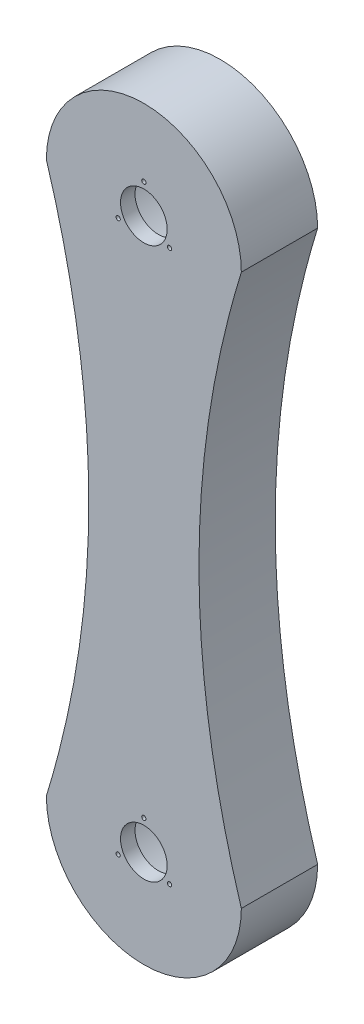
ISO-10303-21;
HEADER;
FILE_DESCRIPTION(('STEP AP214'),'2;1');
FILE_NAME('part.step','',(''),(''),'','','');
FILE_SCHEMA(('AUTOMOTIVE_DESIGN { 1 0 10303 214 1 1 1 1 }'));
ENDSEC;
DATA;
#1=APPLICATION_CONTEXT('core data for automotive mechanical design processes');
#2=APPLICATION_PROTOCOL_DEFINITION('international standard','automotive_design',2000,#1);
#3=PRODUCT_CONTEXT('',#1,'mechanical');
#4=PRODUCT('Part','Part','',(#3));
#5=PRODUCT_RELATED_PRODUCT_CATEGORY('part','',(#4));
#6=PRODUCT_DEFINITION_FORMATION('','',#4);
#7=PRODUCT_DEFINITION_CONTEXT('part definition',#1,'design');
#8=PRODUCT_DEFINITION('design','',#6,#7);
#9=PRODUCT_DEFINITION_SHAPE('','',#8);
#10=(LENGTH_UNIT() NAMED_UNIT(*) SI_UNIT(.MILLI.,.METRE.));
#11=(NAMED_UNIT(*) PLANE_ANGLE_UNIT() SI_UNIT($,.RADIAN.));
#12=(NAMED_UNIT(*) SI_UNIT($,.STERADIAN.) SOLID_ANGLE_UNIT());
#13=UNCERTAINTY_MEASURE_WITH_UNIT(LENGTH_MEASURE(1.E-05),#10,'distance_accuracy_value','');
#14=(GEOMETRIC_REPRESENTATION_CONTEXT(3) GLOBAL_UNCERTAINTY_ASSIGNED_CONTEXT((#13)) GLOBAL_UNIT_ASSIGNED_CONTEXT((#10,
#11,#12)) REPRESENTATION_CONTEXT('',''));
#15=CARTESIAN_POINT('',(0.,0.,0.));
#16=DIRECTION('',(0.,0.,1.));
#17=DIRECTION('',(1.,0.,0.));
#18=AXIS2_PLACEMENT_3D('',#15,#16,#17);
#19=CARTESIAN_POINT('',(-115.,650.,90.));
#20=CARTESIAN_POINT('',(-15.,325.,90.));
#21=CARTESIAN_POINT('',(-115.,0.,90.));
#22=B_SPLINE_CURVE_WITH_KNOTS('',2,(#19,#20,#21),.UNSPECIFIED.,.F.,.F.,(3,3),(0.,1.),.UNSPECIFIED.);
#23=DIRECTION('',(0.,0.,-1.));
#24=VECTOR('',#23,1.);
#25=SURFACE_OF_LINEAR_EXTRUSION('',#22,#24);
#26=CARTESIAN_POINT('',(-115.,650.,0.));
#27=CARTESIAN_POINT('',(-15.,325.,0.));
#28=CARTESIAN_POINT('',(-115.,0.,0.));
#29=B_SPLINE_CURVE_WITH_KNOTS('',2,(#26,#27,#28),.UNSPECIFIED.,.F.,.F.,(3,3),(0.,1.),.UNSPECIFIED.);
#30=CARTESIAN_POINT('',(-115.,650.,0.));
#31=VERTEX_POINT('',#30);
#32=CARTESIAN_POINT('',(-115.,0.,0.));
#33=VERTEX_POINT('',#32);
#34=EDGE_CURVE('E125',#31,#33,#29,.T.);
#35=ORIENTED_EDGE('',*,*,#34,.T.);
#36=DIRECTION('',(0.,0.,-1.));
#37=VECTOR('',#36,1.);
#38=CARTESIAN_POINT('',(-115.,0.,90.));
#39=LINE('',#38,#37);
#40=CARTESIAN_POINT('',(-115.,0.,90.));
#41=VERTEX_POINT('',#40);
#42=EDGE_CURVE('E11',#41,#33,#39,.T.);
#43=ORIENTED_EDGE('',*,*,#42,.F.);
#44=CARTESIAN_POINT('',(-115.,650.,90.));
#45=VERTEX_POINT('',#44);
#46=EDGE_CURVE('E93',#45,#41,#22,.T.);
#47=ORIENTED_EDGE('',*,*,#46,.F.);
#48=DIRECTION('',(0.,0.,-1.));
#49=VECTOR('',#48,1.);
#50=CARTESIAN_POINT('',(-115.,650.,90.));
#51=LINE('',#50,#49);
#52=EDGE_CURVE('E102',#45,#31,#51,.T.);
#53=ORIENTED_EDGE('',*,*,#52,.T.);
#54=EDGE_LOOP('',(#35,#43,#47,#53));
#55=FACE_BOUND('',#54,.T.);
#56=ADVANCED_FACE('F39',(#55),#25,.F.);
#57=CARTESIAN_POINT('',(0.,0.,90.));
#58=DIRECTION('',(0.,0.,-1.));
#59=DIRECTION('',(-1.,0.,0.));
#60=AXIS2_PLACEMENT_3D('',#57,#58,#59);
#61=CYLINDRICAL_SURFACE('',#60,115.);
#62=CARTESIAN_POINT('',(0.,0.,0.));
#63=DIRECTION('',(0.,0.,1.));
#64=DIRECTION('',(1.,0.,0.));
#65=AXIS2_PLACEMENT_3D('',#62,#63,#64);
#66=CIRCLE('',#65,115.);
#67=CARTESIAN_POINT('',(115.,0.,0.));
#68=VERTEX_POINT('',#67);
#69=EDGE_CURVE('E97',#33,#68,#66,.T.);
#70=ORIENTED_EDGE('',*,*,#69,.T.);
#71=DIRECTION('',(0.,0.,-1.));
#72=VECTOR('',#71,1.);
#73=CARTESIAN_POINT('',(115.,0.,90.));
#74=LINE('',#73,#72);
#75=CARTESIAN_POINT('',(115.,0.,90.));
#76=VERTEX_POINT('',#75);
#77=EDGE_CURVE('E49',#76,#68,#74,.T.);
#78=ORIENTED_EDGE('',*,*,#77,.F.);
#79=CARTESIAN_POINT('',(0.,0.,90.));
#80=DIRECTION('',(0.,0.,1.));
#81=DIRECTION('',(1.,0.,0.));
#82=AXIS2_PLACEMENT_3D('',#79,#80,#81);
#83=CIRCLE('',#82,115.);
#84=EDGE_CURVE('E88',#41,#76,#83,.T.);
#85=ORIENTED_EDGE('',*,*,#84,.F.);
#86=ORIENTED_EDGE('',*,*,#42,.T.);
#87=EDGE_LOOP('',(#70,#78,#85,#86));
#88=FACE_BOUND('',#87,.T.);
#89=ADVANCED_FACE('F96',(#88),#61,.T.);
#90=CARTESIAN_POINT('',(115.,0.,90.));
#91=CARTESIAN_POINT('',(15.,325.,90.));
#92=CARTESIAN_POINT('',(115.,650.,90.));
#93=B_SPLINE_CURVE_WITH_KNOTS('',2,(#90,#91,#92),.UNSPECIFIED.,.F.,.F.,(3,3),(0.,1.),.UNSPECIFIED.);
#94=DIRECTION('',(0.,0.,-1.));
#95=VECTOR('',#94,1.);
#96=SURFACE_OF_LINEAR_EXTRUSION('',#93,#95);
#97=CARTESIAN_POINT('',(115.,0.,0.));
#98=CARTESIAN_POINT('',(15.,325.,0.));
#99=CARTESIAN_POINT('',(115.,650.,0.));
#100=B_SPLINE_CURVE_WITH_KNOTS('',2,(#97,#98,#99),.UNSPECIFIED.,.F.,.F.,(3,3),(0.,1.),.UNSPECIFIED.);
#101=CARTESIAN_POINT('',(115.,650.,0.));
#102=VERTEX_POINT('',#101);
#103=EDGE_CURVE('E75',#68,#102,#100,.T.);
#104=ORIENTED_EDGE('',*,*,#103,.T.);
#105=DIRECTION('',(0.,0.,-1.));
#106=VECTOR('',#105,1.);
#107=CARTESIAN_POINT('',(115.,650.,90.));
#108=LINE('',#107,#106);
#109=CARTESIAN_POINT('',(115.,650.,90.));
#110=VERTEX_POINT('',#109);
#111=EDGE_CURVE('E98',#110,#102,#108,.T.);
#112=ORIENTED_EDGE('',*,*,#111,.F.);
#113=EDGE_CURVE('E91',#76,#110,#93,.T.);
#114=ORIENTED_EDGE('',*,*,#113,.F.);
#115=ORIENTED_EDGE('',*,*,#77,.T.);
#116=EDGE_LOOP('',(#104,#112,#114,#115));
#117=FACE_BOUND('',#116,.T.);
#118=ADVANCED_FACE('F100',(#117),#96,.F.);
#119=CARTESIAN_POINT('',(0.,650.,90.));
#120=DIRECTION('',(0.,0.,-1.));
#121=DIRECTION('',(-1.,0.,0.));
#122=AXIS2_PLACEMENT_3D('',#119,#120,#121);
#123=CYLINDRICAL_SURFACE('',#122,115.);
#124=CARTESIAN_POINT('',(0.,650.,0.));
#125=DIRECTION('',(0.,0.,1.));
#126=DIRECTION('',(1.,0.,0.));
#127=AXIS2_PLACEMENT_3D('',#124,#125,#126);
#128=CIRCLE('',#127,115.);
#129=EDGE_CURVE('E81',#102,#31,#128,.T.);
#130=ORIENTED_EDGE('',*,*,#129,.T.);
#131=ORIENTED_EDGE('',*,*,#52,.F.);
#132=CARTESIAN_POINT('',(0.,650.,90.));
#133=DIRECTION('',(0.,0.,1.));
#134=DIRECTION('',(1.,0.,0.));
#135=AXIS2_PLACEMENT_3D('',#132,#133,#134);
#136=CIRCLE('',#135,115.);
#137=EDGE_CURVE('E58',#110,#45,#136,.T.);
#138=ORIENTED_EDGE('',*,*,#137,.F.);
#139=ORIENTED_EDGE('',*,*,#111,.T.);
#140=EDGE_LOOP('',(#130,#131,#138,#139));
#141=FACE_BOUND('',#140,.T.);
#142=ADVANCED_FACE('F114',(#141),#123,.T.);
#143=CARTESIAN_POINT('',(-65.,325.,90.));
#144=DIRECTION('',(0.,0.,-1.));
#145=DIRECTION('',(-1.,0.,0.));
#146=AXIS2_PLACEMENT_3D('',#143,#144,#145);
#147=PLANE('',#146);
#148=CARTESIAN_POINT('',(0.,685.,90.));
#149=DIRECTION('',(0.,0.,1.));
#150=DIRECTION('',(1.,0.,0.));
#151=AXIS2_PLACEMENT_3D('',#148,#149,#150);
#152=CIRCLE('',#151,2.5);
#153=CARTESIAN_POINT('',(2.5,685.,90.));
#154=VERTEX_POINT('',#153);
#155=EDGE_CURVE('E267',#154,#154,#152,.T.);
#156=ORIENTED_EDGE('',*,*,#155,.F.);
#157=EDGE_LOOP('',(#156));
#158=FACE_BOUND('',#157,.T.);
#159=CARTESIAN_POINT('',(30.3108891324553,632.5,90.));
#160=DIRECTION('',(0.,0.,1.));
#161=DIRECTION('',(1.,0.,0.));
#162=AXIS2_PLACEMENT_3D('',#159,#160,#161);
#163=CIRCLE('',#162,2.5);
#164=CARTESIAN_POINT('',(32.8108891324553,632.5,90.));
#165=VERTEX_POINT('',#164);
#166=EDGE_CURVE('E268',#165,#165,#163,.T.);
#167=ORIENTED_EDGE('',*,*,#166,.F.);
#168=EDGE_LOOP('',(#167));
#169=FACE_BOUND('',#168,.T.);
#170=CARTESIAN_POINT('',(-30.3108891324553,632.5,90.));
#171=DIRECTION('',(0.,0.,1.));
#172=DIRECTION('',(1.,0.,0.));
#173=AXIS2_PLACEMENT_3D('',#170,#171,#172);
#174=CIRCLE('',#173,2.50000000000001);
#175=CARTESIAN_POINT('',(-27.8108891324553,632.5,90.));
#176=VERTEX_POINT('',#175);
#177=EDGE_CURVE('E167',#176,#176,#174,.T.);
#178=ORIENTED_EDGE('',*,*,#177,.F.);
#179=EDGE_LOOP('',(#178));
#180=FACE_BOUND('',#179,.T.);
#181=CARTESIAN_POINT('',(0.,650.,90.));
#182=DIRECTION('',(0.,0.,-1.));
#183=DIRECTION('',(-1.,0.,0.));
#184=AXIS2_PLACEMENT_3D('',#181,#182,#183);
#185=CIRCLE('',#184,27.5);
#186=CARTESIAN_POINT('',(-27.5,650.,90.));
#187=VERTEX_POINT('',#186);
#188=EDGE_CURVE('E159',#187,#187,#185,.T.);
#189=ORIENTED_EDGE('',*,*,#188,.T.);
#190=EDGE_LOOP('',(#189));
#191=FACE_BOUND('',#190,.T.);
#192=CARTESIAN_POINT('',(30.3108891324553,-17.5000000000001,90.));
#193=DIRECTION('',(0.,0.,1.));
#194=DIRECTION('',(-0.500000000000004,-0.866025403784436,0.));
#195=AXIS2_PLACEMENT_3D('',#192,#193,#194);
#196=CIRCLE('',#195,2.5);
#197=CARTESIAN_POINT('',(29.0608891324553,-19.6650635094612,90.));
#198=VERTEX_POINT('',#197);
#199=EDGE_CURVE('E155',#198,#198,#196,.T.);
#200=ORIENTED_EDGE('',*,*,#199,.F.);
#201=EDGE_LOOP('',(#200));
#202=FACE_BOUND('',#201,.T.);
#203=CARTESIAN_POINT('',(-30.3108891324555,-17.4999999999997,90.));
#204=DIRECTION('',(0.,0.,1.));
#205=DIRECTION('',(-0.499999999999992,0.866025403784443,0.));
#206=AXIS2_PLACEMENT_3D('',#203,#204,#205);
#207=CIRCLE('',#206,2.5);
#208=CARTESIAN_POINT('',(-31.5608891324555,-15.3349364905386,90.));
#209=VERTEX_POINT('',#208);
#210=EDGE_CURVE('E184',#209,#209,#207,.T.);
#211=ORIENTED_EDGE('',*,*,#210,.F.);
#212=EDGE_LOOP('',(#211));
#213=FACE_BOUND('',#212,.T.);
#214=CARTESIAN_POINT('',(0.,0.,90.));
#215=DIRECTION('',(0.,0.,-1.));
#216=DIRECTION('',(-1.,0.,0.));
#217=AXIS2_PLACEMENT_3D('',#214,#215,#216);
#218=CIRCLE('',#217,27.5);
#219=CARTESIAN_POINT('',(-27.5,0.,90.));
#220=VERTEX_POINT('',#219);
#221=EDGE_CURVE('E193',#220,#220,#218,.T.);
#222=ORIENTED_EDGE('',*,*,#221,.T.);
#223=EDGE_LOOP('',(#222));
#224=FACE_BOUND('',#223,.T.);
#225=CARTESIAN_POINT('',(0.,35.,90.));
#226=DIRECTION('',(0.,0.,1.));
#227=DIRECTION('',(1.,0.,0.));
#228=AXIS2_PLACEMENT_3D('',#225,#226,#227);
#229=CIRCLE('',#228,2.5);
#230=CARTESIAN_POINT('',(2.5,35.,90.));
#231=VERTEX_POINT('',#230);
#232=EDGE_CURVE('E150',#231,#231,#229,.T.);
#233=ORIENTED_EDGE('',*,*,#232,.F.);
#234=EDGE_LOOP('',(#233));
#235=FACE_BOUND('',#234,.T.);
#236=ORIENTED_EDGE('',*,*,#46,.T.);
#237=ORIENTED_EDGE('',*,*,#84,.T.);
#238=ORIENTED_EDGE('',*,*,#113,.T.);
#239=ORIENTED_EDGE('',*,*,#137,.T.);
#240=EDGE_LOOP('',(#236,#237,#238,#239));
#241=FACE_BOUND('',#240,.T.);
#242=ADVANCED_FACE('F89',(#158,#169,#180,#191,#202,#213,#224,#235,#241),#147,.F.);
#243=CARTESIAN_POINT('',(-65.,325.,0.));
#244=DIRECTION('',(0.,0.,-1.));
#245=DIRECTION('',(-1.,0.,0.));
#246=AXIS2_PLACEMENT_3D('',#243,#244,#245);
#247=PLANE('',#246);
#248=CARTESIAN_POINT('',(0.,650.,0.));
#249=DIRECTION('',(0.,0.,-1.));
#250=DIRECTION('',(-1.,0.,0.));
#251=AXIS2_PLACEMENT_3D('',#248,#249,#250);
#252=CIRCLE('',#251,97.5);
#253=CARTESIAN_POINT('',(-97.5,650.,0.));
#254=VERTEX_POINT('',#253);
#255=EDGE_CURVE('E162',#254,#254,#252,.T.);
#256=ORIENTED_EDGE('',*,*,#255,.F.);
#257=EDGE_LOOP('',(#256));
#258=FACE_BOUND('',#257,.T.);
#259=CARTESIAN_POINT('',(0.,0.,0.));
#260=DIRECTION('',(0.,0.,-1.));
#261=DIRECTION('',(-1.,0.,0.));
#262=AXIS2_PLACEMENT_3D('',#259,#260,#261);
#263=CIRCLE('',#262,97.5);
#264=CARTESIAN_POINT('',(-97.5,0.,0.));
#265=VERTEX_POINT('',#264);
#266=EDGE_CURVE('E130',#265,#265,#263,.T.);
#267=ORIENTED_EDGE('',*,*,#266,.F.);
#268=EDGE_LOOP('',(#267));
#269=FACE_BOUND('',#268,.T.);
#270=ORIENTED_EDGE('',*,*,#34,.F.);
#271=ORIENTED_EDGE('',*,*,#129,.F.);
#272=ORIENTED_EDGE('',*,*,#103,.F.);
#273=ORIENTED_EDGE('',*,*,#69,.F.);
#274=EDGE_LOOP('',(#270,#271,#272,#273));
#275=FACE_BOUND('',#274,.T.);
#276=ADVANCED_FACE('F209',(#258,#269,#275),#247,.T.);
#277=CARTESIAN_POINT('',(0.,0.,72.91));
#278=DIRECTION('',(0.,0.,-1.));
#279=DIRECTION('',(-1.,0.,0.));
#280=AXIS2_PLACEMENT_3D('',#277,#278,#279);
#281=CYLINDRICAL_SURFACE('',#280,97.5);
#282=CARTESIAN_POINT('',(0.,0.,72.91));
#283=DIRECTION('',(0.,0.,-1.));
#284=DIRECTION('',(-1.,0.,0.));
#285=AXIS2_PLACEMENT_3D('',#282,#283,#284);
#286=CIRCLE('',#285,97.5);
#287=CARTESIAN_POINT('',(-97.5,0.,72.91));
#288=VERTEX_POINT('',#287);
#289=EDGE_CURVE('E127',#288,#288,#286,.T.);
#290=ORIENTED_EDGE('',*,*,#289,.F.);
#291=EDGE_LOOP('',(#290));
#292=FACE_BOUND('',#291,.T.);
#293=ORIENTED_EDGE('',*,*,#266,.T.);
#294=EDGE_LOOP('',(#293));
#295=FACE_BOUND('',#294,.T.);
#296=ADVANCED_FACE('F207',(#292,#295),#281,.F.);
#297=CARTESIAN_POINT('',(0.,0.,72.91));
#298=DIRECTION('',(0.,0.,-1.));
#299=DIRECTION('',(-1.,0.,0.));
#300=AXIS2_PLACEMENT_3D('',#297,#298,#299);
#301=PLANE('',#300);
#302=CARTESIAN_POINT('',(30.3108891324553,-17.5000000000001,72.91));
#303=DIRECTION('',(0.,0.,-1.));
#304=DIRECTION('',(-1.,0.,0.));
#305=AXIS2_PLACEMENT_3D('',#302,#303,#304);
#306=CIRCLE('',#305,2.5);
#307=CARTESIAN_POINT('',(27.8108891324553,-17.5000000000001,72.91));
#308=VERTEX_POINT('',#307);
#309=EDGE_CURVE('E154',#308,#308,#306,.T.);
#310=ORIENTED_EDGE('',*,*,#309,.F.);
#311=EDGE_LOOP('',(#310));
#312=FACE_BOUND('',#311,.T.);
#313=CARTESIAN_POINT('',(-30.3108891324555,-17.4999999999997,72.91));
#314=DIRECTION('',(0.,0.,-1.));
#315=DIRECTION('',(-1.,0.,0.));
#316=AXIS2_PLACEMENT_3D('',#313,#314,#315);
#317=CIRCLE('',#316,2.5);
#318=CARTESIAN_POINT('',(-32.8108891324555,-17.4999999999997,72.91));
#319=VERTEX_POINT('',#318);
#320=EDGE_CURVE('E151',#319,#319,#317,.T.);
#321=ORIENTED_EDGE('',*,*,#320,.F.);
#322=EDGE_LOOP('',(#321));
#323=FACE_BOUND('',#322,.T.);
#324=CARTESIAN_POINT('',(0.,0.,72.91));
#325=DIRECTION('',(0.,0.,-1.));
#326=DIRECTION('',(-1.,0.,0.));
#327=AXIS2_PLACEMENT_3D('',#324,#325,#326);
#328=CIRCLE('',#327,27.5);
#329=CARTESIAN_POINT('',(-27.5,0.,72.91));
#330=VERTEX_POINT('',#329);
#331=EDGE_CURVE('E158',#330,#330,#328,.T.);
#332=ORIENTED_EDGE('',*,*,#331,.F.);
#333=EDGE_LOOP('',(#332));
#334=FACE_BOUND('',#333,.T.);
#335=CARTESIAN_POINT('',(0.,35.,72.91));
#336=DIRECTION('',(0.,0.,-1.));
#337=DIRECTION('',(-1.,0.,0.));
#338=AXIS2_PLACEMENT_3D('',#335,#336,#337);
#339=CIRCLE('',#338,2.5);
#340=CARTESIAN_POINT('',(-2.5,35.,72.91));
#341=VERTEX_POINT('',#340);
#342=EDGE_CURVE('E147',#341,#341,#339,.T.);
#343=ORIENTED_EDGE('',*,*,#342,.F.);
#344=EDGE_LOOP('',(#343));
#345=FACE_BOUND('',#344,.T.);
#346=ORIENTED_EDGE('',*,*,#289,.T.);
#347=EDGE_LOOP('',(#346));
#348=FACE_BOUND('',#347,.T.);
#349=ADVANCED_FACE('F217',(#312,#323,#334,#345,#348),#301,.T.);
#350=CARTESIAN_POINT('',(0.,35.,70.));
#351=DIRECTION('',(0.,0.,1.));
#352=DIRECTION('',(1.,0.,0.));
#353=AXIS2_PLACEMENT_3D('',#350,#351,#352);
#354=CYLINDRICAL_SURFACE('',#353,2.5);
#355=ORIENTED_EDGE('',*,*,#342,.T.);
#356=EDGE_LOOP('',(#355));
#357=FACE_BOUND('',#356,.T.);
#358=ORIENTED_EDGE('',*,*,#232,.T.);
#359=EDGE_LOOP('',(#358));
#360=FACE_BOUND('',#359,.T.);
#361=ADVANCED_FACE('F227',(#357,#360),#354,.F.);
#362=CARTESIAN_POINT('',(0.,0.,92.91));
#363=DIRECTION('',(0.,0.,-1.));
#364=DIRECTION('',(-1.,0.,0.));
#365=AXIS2_PLACEMENT_3D('',#362,#363,#364);
#366=CYLINDRICAL_SURFACE('',#365,27.5);
#367=ORIENTED_EDGE('',*,*,#331,.T.);
#368=EDGE_LOOP('',(#367));
#369=FACE_BOUND('',#368,.T.);
#370=ORIENTED_EDGE('',*,*,#221,.F.);
#371=EDGE_LOOP('',(#370));
#372=FACE_BOUND('',#371,.T.);
#373=ADVANCED_FACE('F231',(#369,#372),#366,.F.);
#374=CARTESIAN_POINT('',(-30.3108891324555,-17.4999999999997,70.));
#375=DIRECTION('',(0.,0.,1.));
#376=DIRECTION('',(1.,0.,0.));
#377=AXIS2_PLACEMENT_3D('',#374,#375,#376);
#378=CYLINDRICAL_SURFACE('',#377,2.5);
#379=ORIENTED_EDGE('',*,*,#320,.T.);
#380=EDGE_LOOP('',(#379));
#381=FACE_BOUND('',#380,.T.);
#382=ORIENTED_EDGE('',*,*,#210,.T.);
#383=EDGE_LOOP('',(#382));
#384=FACE_BOUND('',#383,.T.);
#385=ADVANCED_FACE('F235',(#381,#384),#378,.F.);
#386=CARTESIAN_POINT('',(30.3108891324553,-17.5000000000001,70.));
#387=DIRECTION('',(0.,0.,1.));
#388=DIRECTION('',(1.,0.,0.));
#389=AXIS2_PLACEMENT_3D('',#386,#387,#388);
#390=CYLINDRICAL_SURFACE('',#389,2.5);
#391=ORIENTED_EDGE('',*,*,#309,.T.);
#392=EDGE_LOOP('',(#391));
#393=FACE_BOUND('',#392,.T.);
#394=ORIENTED_EDGE('',*,*,#199,.T.);
#395=EDGE_LOOP('',(#394));
#396=FACE_BOUND('',#395,.T.);
#397=ADVANCED_FACE('F239',(#393,#396),#390,.F.);
#398=CARTESIAN_POINT('',(0.,650.,72.91));
#399=DIRECTION('',(0.,0.,-1.));
#400=DIRECTION('',(-1.,0.,0.));
#401=AXIS2_PLACEMENT_3D('',#398,#399,#400);
#402=CYLINDRICAL_SURFACE('',#401,97.5);
#403=CARTESIAN_POINT('',(0.,650.,72.91));
#404=DIRECTION('',(0.,0.,-1.));
#405=DIRECTION('',(-1.,0.,0.));
#406=AXIS2_PLACEMENT_3D('',#403,#404,#405);
#407=CIRCLE('',#406,97.5);
#408=CARTESIAN_POINT('',(-97.5,650.,72.91));
#409=VERTEX_POINT('',#408);
#410=EDGE_CURVE('E181',#409,#409,#407,.T.);
#411=ORIENTED_EDGE('',*,*,#410,.F.);
#412=EDGE_LOOP('',(#411));
#413=FACE_BOUND('',#412,.T.);
#414=ORIENTED_EDGE('',*,*,#255,.T.);
#415=EDGE_LOOP('',(#414));
#416=FACE_BOUND('',#415,.T.);
#417=ADVANCED_FACE('F242',(#413,#416),#402,.F.);
#418=CARTESIAN_POINT('',(0.,650.,72.91));
#419=DIRECTION('',(0.,0.,-1.));
#420=DIRECTION('',(-1.,0.,0.));
#421=AXIS2_PLACEMENT_3D('',#418,#419,#420);
#422=PLANE('',#421);
#423=CARTESIAN_POINT('',(0.,685.,72.91));
#424=DIRECTION('',(0.,0.,-1.));
#425=DIRECTION('',(-1.,0.,0.));
#426=AXIS2_PLACEMENT_3D('',#423,#424,#425);
#427=CIRCLE('',#426,2.5);
#428=CARTESIAN_POINT('',(-2.5,685.,72.91));
#429=VERTEX_POINT('',#428);
#430=EDGE_CURVE('E43',#429,#429,#427,.T.);
#431=ORIENTED_EDGE('',*,*,#430,.F.);
#432=EDGE_LOOP('',(#431));
#433=FACE_BOUND('',#432,.T.);
#434=CARTESIAN_POINT('',(30.3108891324553,632.5,72.91));
#435=DIRECTION('',(0.,0.,-1.));
#436=DIRECTION('',(-1.,0.,0.));
#437=AXIS2_PLACEMENT_3D('',#434,#435,#436);
#438=CIRCLE('',#437,2.5);
#439=CARTESIAN_POINT('',(27.8108891324553,632.5,72.91));
#440=VERTEX_POINT('',#439);
#441=EDGE_CURVE('E166',#440,#440,#438,.T.);
#442=ORIENTED_EDGE('',*,*,#441,.F.);
#443=EDGE_LOOP('',(#442));
#444=FACE_BOUND('',#443,.T.);
#445=CARTESIAN_POINT('',(-30.3108891324553,632.5,72.91));
#446=DIRECTION('',(0.,0.,-1.));
#447=DIRECTION('',(-1.,0.,0.));
#448=AXIS2_PLACEMENT_3D('',#445,#446,#447);
#449=CIRCLE('',#448,2.50000000000001);
#450=CARTESIAN_POINT('',(-32.8108891324553,632.5,72.91));
#451=VERTEX_POINT('',#450);
#452=EDGE_CURVE('E164',#451,#451,#449,.T.);
#453=ORIENTED_EDGE('',*,*,#452,.F.);
#454=EDGE_LOOP('',(#453));
#455=FACE_BOUND('',#454,.T.);
#456=CARTESIAN_POINT('',(0.,650.,72.91));
#457=DIRECTION('',(0.,0.,-1.));
#458=DIRECTION('',(-1.,0.,0.));
#459=AXIS2_PLACEMENT_3D('',#456,#457,#458);
#460=CIRCLE('',#459,27.5);
#461=CARTESIAN_POINT('',(-27.5,650.,72.91));
#462=VERTEX_POINT('',#461);
#463=EDGE_CURVE('E163',#462,#462,#460,.T.);
#464=ORIENTED_EDGE('',*,*,#463,.F.);
#465=EDGE_LOOP('',(#464));
#466=FACE_BOUND('',#465,.T.);
#467=ORIENTED_EDGE('',*,*,#410,.T.);
#468=EDGE_LOOP('',(#467));
#469=FACE_BOUND('',#468,.T.);
#470=ADVANCED_FACE('F245',(#433,#444,#455,#466,#469),#422,.T.);
#471=CARTESIAN_POINT('',(0.,650.,145.82));
#472=DIRECTION('',(0.,0.,-1.));
#473=DIRECTION('',(-1.,0.,0.));
#474=AXIS2_PLACEMENT_3D('',#471,#472,#473);
#475=CYLINDRICAL_SURFACE('',#474,27.5);
#476=ORIENTED_EDGE('',*,*,#463,.T.);
#477=EDGE_LOOP('',(#476));
#478=FACE_BOUND('',#477,.T.);
#479=ORIENTED_EDGE('',*,*,#188,.F.);
#480=EDGE_LOOP('',(#479));
#481=FACE_BOUND('',#480,.T.);
#482=ADVANCED_FACE('F249',(#478,#481),#475,.F.);
#483=CARTESIAN_POINT('',(-30.3108891324553,632.5,17.09));
#484=DIRECTION('',(0.,0.,1.));
#485=DIRECTION('',(1.,0.,0.));
#486=AXIS2_PLACEMENT_3D('',#483,#484,#485);
#487=CYLINDRICAL_SURFACE('',#486,2.50000000000001);
#488=ORIENTED_EDGE('',*,*,#452,.T.);
#489=EDGE_LOOP('',(#488));
#490=FACE_BOUND('',#489,.T.);
#491=ORIENTED_EDGE('',*,*,#177,.T.);
#492=EDGE_LOOP('',(#491));
#493=FACE_BOUND('',#492,.T.);
#494=ADVANCED_FACE('F253',(#490,#493),#487,.F.);
#495=CARTESIAN_POINT('',(30.3108891324553,632.5,17.09));
#496=DIRECTION('',(0.,0.,1.));
#497=DIRECTION('',(1.,0.,0.));
#498=AXIS2_PLACEMENT_3D('',#495,#496,#497);
#499=CYLINDRICAL_SURFACE('',#498,2.5);
#500=ORIENTED_EDGE('',*,*,#441,.T.);
#501=EDGE_LOOP('',(#500));
#502=FACE_BOUND('',#501,.T.);
#503=ORIENTED_EDGE('',*,*,#166,.T.);
#504=EDGE_LOOP('',(#503));
#505=FACE_BOUND('',#504,.T.);
#506=ADVANCED_FACE('F256',(#502,#505),#499,.F.);
#507=CARTESIAN_POINT('',(0.,685.,17.09));
#508=DIRECTION('',(0.,0.,1.));
#509=DIRECTION('',(1.,0.,0.));
#510=AXIS2_PLACEMENT_3D('',#507,#508,#509);
#511=CYLINDRICAL_SURFACE('',#510,2.5);
#512=ORIENTED_EDGE('',*,*,#430,.T.);
#513=EDGE_LOOP('',(#512));
#514=FACE_BOUND('',#513,.T.);
#515=ORIENTED_EDGE('',*,*,#155,.T.);
#516=EDGE_LOOP('',(#515));
#517=FACE_BOUND('',#516,.T.);
#518=ADVANCED_FACE('F260',(#514,#517),#511,.F.);
#519=CLOSED_SHELL('',(#56,#89,#118,#142,#242,#276,#296,#349,#361,#373,#385,#397,#417,#470,#482,
#494,#506,#518));
#520=MANIFOLD_SOLID_BREP('B2',#519);
#521=ADVANCED_BREP_SHAPE_REPRESENTATION('',(#18,#520),#14);
#522=SHAPE_DEFINITION_REPRESENTATION(#9,#521);
ENDSEC;
END-ISO-10303-21;
